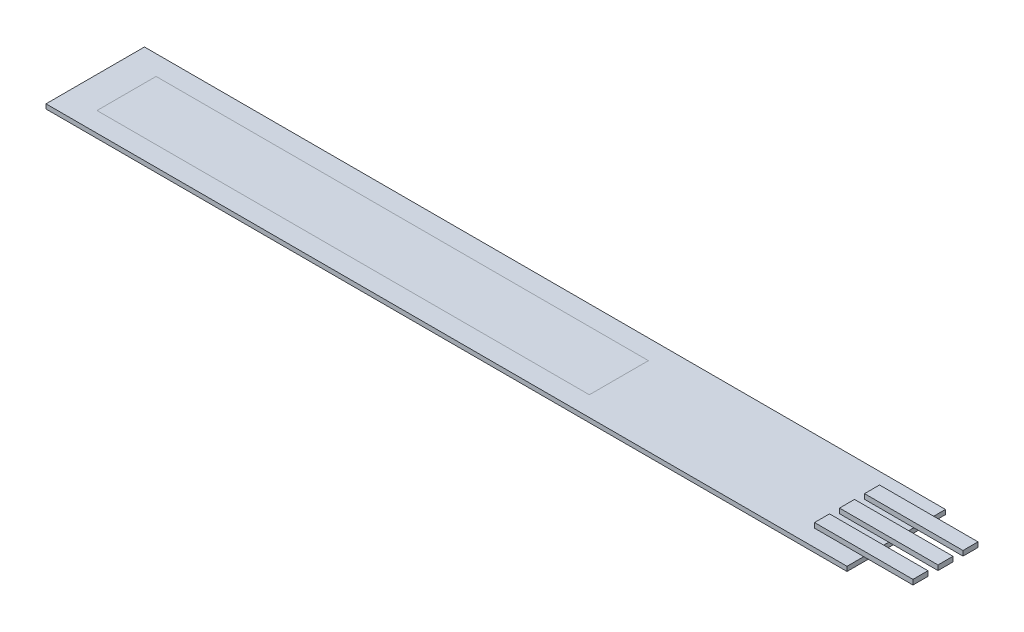
ISO-10303-21;
HEADER;
FILE_DESCRIPTION(('STEP AP214'),'2;1');
FILE_NAME('part.step','',(''),(''),'','','');
FILE_SCHEMA(('AUTOMOTIVE_DESIGN { 1 0 10303 214 1 1 1 1 }'));
ENDSEC;
DATA;
#1=APPLICATION_CONTEXT('core data for automotive mechanical design processes');
#2=APPLICATION_PROTOCOL_DEFINITION('international standard','automotive_design',2000,#1);
#3=PRODUCT_CONTEXT('',#1,'mechanical');
#4=PRODUCT('Part','Part','',(#3));
#5=PRODUCT_RELATED_PRODUCT_CATEGORY('part','',(#4));
#6=PRODUCT_DEFINITION_FORMATION('','',#4);
#7=PRODUCT_DEFINITION_CONTEXT('part definition',#1,'design');
#8=PRODUCT_DEFINITION('design','',#6,#7);
#9=PRODUCT_DEFINITION_SHAPE('','',#8);
#10=(LENGTH_UNIT() NAMED_UNIT(*) SI_UNIT(.MILLI.,.METRE.));
#11=(NAMED_UNIT(*) PLANE_ANGLE_UNIT() SI_UNIT($,.RADIAN.));
#12=(NAMED_UNIT(*) SI_UNIT($,.STERADIAN.) SOLID_ANGLE_UNIT());
#13=UNCERTAINTY_MEASURE_WITH_UNIT(LENGTH_MEASURE(1.E-05),#10,'distance_accuracy_value','');
#14=(GEOMETRIC_REPRESENTATION_CONTEXT(3) GLOBAL_UNCERTAINTY_ASSIGNED_CONTEXT((#13)) GLOBAL_UNIT_ASSIGNED_CONTEXT((#10,
#11,#12)) REPRESENTATION_CONTEXT('',''));
#15=CARTESIAN_POINT('',(0.,0.,0.));
#16=DIRECTION('',(0.,0.,1.));
#17=DIRECTION('',(1.,0.,0.));
#18=AXIS2_PLACEMENT_3D('',#15,#16,#17);
#19=CARTESIAN_POINT('',(53.18,-50.3587132480567,3.));
#20=DIRECTION('',(1.,0.,0.));
#21=DIRECTION('',(0.,0.,-1.));
#22=AXIS2_PLACEMENT_3D('',#19,#20,#21);
#23=PLANE('',#22);
#24=DIRECTION('',(0.,0.,1.));
#25=VECTOR('',#24,1.);
#26=CARTESIAN_POINT('',(53.18,0.,3.));
#27=LINE('',#26,#25);
#28=CARTESIAN_POINT('',(53.18,0.,-3.));
#29=VERTEX_POINT('',#28);
#30=CARTESIAN_POINT('',(53.18,0.,3.));
#31=VERTEX_POINT('',#30);
#32=EDGE_CURVE('E51',#29,#31,#27,.T.);
#33=ORIENTED_EDGE('',*,*,#32,.F.);
#34=DIRECTION('',(0.,1.,0.));
#35=VECTOR('',#34,1.);
#36=CARTESIAN_POINT('',(53.18,-50.3587132480567,-3.));
#37=LINE('',#36,#35);
#38=CARTESIAN_POINT('',(53.18,0.46,-3.));
#39=VERTEX_POINT('',#38);
#40=EDGE_CURVE('E77',#29,#39,#37,.T.);
#41=ORIENTED_EDGE('',*,*,#40,.T.);
#42=DIRECTION('',(0.,0.,-1.));
#43=VECTOR('',#42,1.);
#44=CARTESIAN_POINT('',(53.18,0.46,3.));
#45=LINE('',#44,#43);
#46=CARTESIAN_POINT('',(53.18,0.46,3.));
#47=VERTEX_POINT('',#46);
#48=EDGE_CURVE('E81',#47,#39,#45,.T.);
#49=ORIENTED_EDGE('',*,*,#48,.F.);
#50=DIRECTION('',(0.,1.,0.));
#51=VECTOR('',#50,1.);
#52=CARTESIAN_POINT('',(53.18,-50.3587132480567,3.));
#53=LINE('',#52,#51);
#54=EDGE_CURVE('E103',#31,#47,#53,.T.);
#55=ORIENTED_EDGE('',*,*,#54,.F.);
#56=EDGE_LOOP('',(#33,#41,#49,#55));
#57=FACE_BOUND('',#56,.T.);
#58=ADVANCED_FACE('F43',(#57),#23,.T.);
#59=CARTESIAN_POINT('',(3.18,-50.3587132480567,3.));
#60=DIRECTION('',(0.,0.,1.));
#61=DIRECTION('',(1.,0.,0.));
#62=AXIS2_PLACEMENT_3D('',#59,#60,#61);
#63=PLANE('',#62);
#64=DIRECTION('',(-1.,0.,0.));
#65=VECTOR('',#64,1.);
#66=CARTESIAN_POINT('',(3.18,0.,3.));
#67=LINE('',#66,#65);
#68=CARTESIAN_POINT('',(3.18,0.,3.));
#69=VERTEX_POINT('',#68);
#70=EDGE_CURVE('E115',#31,#69,#67,.T.);
#71=ORIENTED_EDGE('',*,*,#70,.F.);
#72=ORIENTED_EDGE('',*,*,#54,.T.);
#73=DIRECTION('',(1.,0.,0.));
#74=VECTOR('',#73,1.);
#75=CARTESIAN_POINT('',(3.18,0.46,3.));
#76=LINE('',#75,#74);
#77=CARTESIAN_POINT('',(3.18,0.46,3.));
#78=VERTEX_POINT('',#77);
#79=EDGE_CURVE('E85',#78,#47,#76,.T.);
#80=ORIENTED_EDGE('',*,*,#79,.F.);
#81=DIRECTION('',(0.,1.,0.));
#82=VECTOR('',#81,1.);
#83=CARTESIAN_POINT('',(3.18,-50.3587132480567,3.));
#84=LINE('',#83,#82);
#85=EDGE_CURVE('E106',#69,#78,#84,.T.);
#86=ORIENTED_EDGE('',*,*,#85,.F.);
#87=EDGE_LOOP('',(#71,#72,#80,#86));
#88=FACE_BOUND('',#87,.T.);
#89=ADVANCED_FACE('F114',(#88),#63,.T.);
#90=CARTESIAN_POINT('',(3.18,-50.3587132480567,-3.));
#91=DIRECTION('',(-1.,0.,0.));
#92=DIRECTION('',(0.,0.,1.));
#93=AXIS2_PLACEMENT_3D('',#90,#91,#92);
#94=PLANE('',#93);
#95=DIRECTION('',(0.,0.,-1.));
#96=VECTOR('',#95,1.);
#97=CARTESIAN_POINT('',(3.18,0.,-3.));
#98=LINE('',#97,#96);
#99=CARTESIAN_POINT('',(3.18,0.,-3.));
#100=VERTEX_POINT('',#99);
#101=EDGE_CURVE('E105',#69,#100,#98,.T.);
#102=ORIENTED_EDGE('',*,*,#101,.F.);
#103=ORIENTED_EDGE('',*,*,#85,.T.);
#104=DIRECTION('',(0.,0.,1.));
#105=VECTOR('',#104,1.);
#106=CARTESIAN_POINT('',(3.18,0.46,-3.));
#107=LINE('',#106,#105);
#108=CARTESIAN_POINT('',(3.18,0.46,-3.));
#109=VERTEX_POINT('',#108);
#110=EDGE_CURVE('E93',#109,#78,#107,.T.);
#111=ORIENTED_EDGE('',*,*,#110,.F.);
#112=DIRECTION('',(0.,1.,0.));
#113=VECTOR('',#112,1.);
#114=CARTESIAN_POINT('',(3.18,-50.3587132480567,-3.));
#115=LINE('',#114,#113);
#116=EDGE_CURVE('E84',#100,#109,#115,.T.);
#117=ORIENTED_EDGE('',*,*,#116,.F.);
#118=EDGE_LOOP('',(#102,#103,#111,#117));
#119=FACE_BOUND('',#118,.T.);
#120=ADVANCED_FACE('F111',(#119),#94,.T.);
#121=CARTESIAN_POINT('',(53.18,-50.3587132480567,-3.));
#122=DIRECTION('',(0.,0.,-1.));
#123=DIRECTION('',(-1.,0.,0.));
#124=AXIS2_PLACEMENT_3D('',#121,#122,#123);
#125=PLANE('',#124);
#126=DIRECTION('',(1.,0.,0.));
#127=VECTOR('',#126,1.);
#128=CARTESIAN_POINT('',(53.18,0.,-3.));
#129=LINE('',#128,#127);
#130=EDGE_CURVE('E12',#100,#29,#129,.T.);
#131=ORIENTED_EDGE('',*,*,#130,.F.);
#132=ORIENTED_EDGE('',*,*,#116,.T.);
#133=DIRECTION('',(-1.,0.,0.));
#134=VECTOR('',#133,1.);
#135=CARTESIAN_POINT('',(53.18,0.46,-3.));
#136=LINE('',#135,#134);
#137=EDGE_CURVE('E87',#39,#109,#136,.T.);
#138=ORIENTED_EDGE('',*,*,#137,.F.);
#139=ORIENTED_EDGE('',*,*,#40,.F.);
#140=EDGE_LOOP('',(#131,#132,#138,#139));
#141=FACE_BOUND('',#140,.T.);
#142=ADVANCED_FACE('F88',(#141),#125,.T.);
#143=CARTESIAN_POINT('',(0.,0.46,0.));
#144=DIRECTION('',(0.,1.,0.));
#145=DIRECTION('',(0.,0.,1.));
#146=AXIS2_PLACEMENT_3D('',#143,#144,#145);
#147=PLANE('',#146);
#148=ORIENTED_EDGE('',*,*,#48,.T.);
#149=ORIENTED_EDGE('',*,*,#137,.T.);
#150=ORIENTED_EDGE('',*,*,#110,.T.);
#151=ORIENTED_EDGE('',*,*,#79,.T.);
#152=EDGE_LOOP('',(#148,#149,#150,#151));
#153=FACE_BOUND('',#152,.T.);
#154=ADVANCED_FACE('F95',(#153),#147,.T.);
#155=CARTESIAN_POINT('',(0.,0.,0.));
#156=DIRECTION('',(0.,1.,0.));
#157=DIRECTION('',(0.,0.,1.));
#158=AXIS2_PLACEMENT_3D('',#155,#156,#157);
#159=PLANE('',#158);
#160=ORIENTED_EDGE('',*,*,#32,.T.);
#161=ORIENTED_EDGE('',*,*,#70,.T.);
#162=ORIENTED_EDGE('',*,*,#101,.T.);
#163=ORIENTED_EDGE('',*,*,#130,.T.);
#164=EDGE_LOOP('',(#160,#161,#162,#163));
#165=FACE_BOUND('',#164,.T.);
#166=ADVANCED_FACE('F116',(#165),#159,.F.);
#167=CLOSED_SHELL('',(#58,#89,#120,#142,#154,#166));
#168=MANIFOLD_SOLID_BREP('B2',#167);
#169=CARTESIAN_POINT('',(0.,0.46,0.));
#170=DIRECTION('',(0.,1.,0.));
#171=DIRECTION('',(0.,0.,1.));
#172=AXIS2_PLACEMENT_3D('',#169,#170,#171);
#173=PLANE('',#172);
#174=DIRECTION('',(1.,0.,0.));
#175=VECTOR('',#174,1.);
#176=CARTESIAN_POINT('',(3.18,0.46,3.));
#177=LINE('',#176,#175);
#178=CARTESIAN_POINT('',(3.18,0.46,3.));
#179=VERTEX_POINT('',#178);
#180=CARTESIAN_POINT('',(53.18,0.46,3.));
#181=VERTEX_POINT('',#180);
#182=EDGE_CURVE('E419',#179,#181,#177,.T.);
#183=ORIENTED_EDGE('',*,*,#182,.F.);
#184=DIRECTION('',(0.,0.,1.));
#185=VECTOR('',#184,1.);
#186=CARTESIAN_POINT('',(3.18,0.46,-3.));
#187=LINE('',#186,#185);
#188=CARTESIAN_POINT('',(3.18,0.46,-3.));
#189=VERTEX_POINT('',#188);
#190=EDGE_CURVE('E417',#189,#179,#187,.T.);
#191=ORIENTED_EDGE('',*,*,#190,.F.);
#192=DIRECTION('',(-1.,0.,0.));
#193=VECTOR('',#192,1.);
#194=CARTESIAN_POINT('',(3.18,0.46,-3.));
#195=LINE('',#194,#193);
#196=CARTESIAN_POINT('',(53.18,0.46,-3.));
#197=VERTEX_POINT('',#196);
#198=EDGE_CURVE('E425',#197,#189,#195,.T.);
#199=ORIENTED_EDGE('',*,*,#198,.F.);
#200=DIRECTION('',(0.,0.,-1.));
#201=VECTOR('',#200,1.);
#202=CARTESIAN_POINT('',(53.18,0.46,-3.));
#203=LINE('',#202,#201);
#204=EDGE_CURVE('E422',#181,#197,#203,.T.);
#205=ORIENTED_EDGE('',*,*,#204,.F.);
#206=EDGE_LOOP('',(#183,#191,#199,#205));
#207=FACE_BOUND('',#206,.T.);
#208=DIRECTION('',(0.,0.,-1.));
#209=VECTOR('',#208,1.);
#210=CARTESIAN_POINT('',(81.35,0.46,-5.));
#211=LINE('',#210,#209);
#212=CARTESIAN_POINT('',(81.35,0.46,5.));
#213=VERTEX_POINT('',#212);
#214=CARTESIAN_POINT('',(81.35,0.46,3.30108611503275));
#215=VERTEX_POINT('',#214);
#216=EDGE_CURVE('E455',#213,#215,#211,.T.);
#217=ORIENTED_EDGE('',*,*,#216,.T.);
#218=DIRECTION('',(1.,0.,0.));
#219=VECTOR('',#218,1.);
#220=CARTESIAN_POINT('',(76.35,0.46,3.30108611503275));
#221=LINE('',#220,#219);
#222=CARTESIAN_POINT('',(76.35,0.46,3.30108611503275));
#223=VERTEX_POINT('',#222);
#224=EDGE_CURVE('E184',#223,#215,#221,.T.);
#225=ORIENTED_EDGE('',*,*,#224,.F.);
#226=DIRECTION('',(0.,0.,1.));
#227=VECTOR('',#226,1.);
#228=CARTESIAN_POINT('',(76.35,0.46,1.77891388496725));
#229=LINE('',#228,#227);
#230=CARTESIAN_POINT('',(76.35,0.46,1.77891388496725));
#231=VERTEX_POINT('',#230);
#232=EDGE_CURVE('E189',#231,#223,#229,.T.);
#233=ORIENTED_EDGE('',*,*,#232,.F.);
#234=DIRECTION('',(-1.,0.,0.));
#235=VECTOR('',#234,1.);
#236=CARTESIAN_POINT('',(76.35,0.46,1.77891388496725));
#237=LINE('',#236,#235);
#238=CARTESIAN_POINT('',(81.35,0.46,1.77891388496725));
#239=VERTEX_POINT('',#238);
#240=EDGE_CURVE('E519',#239,#231,#237,.T.);
#241=ORIENTED_EDGE('',*,*,#240,.F.);
#242=CARTESIAN_POINT('',(81.35,0.46,0.761086115032753));
#243=VERTEX_POINT('',#242);
#244=EDGE_CURVE('E459',#239,#243,#211,.T.);
#245=ORIENTED_EDGE('',*,*,#244,.T.);
#246=DIRECTION('',(1.,0.,0.));
#247=VECTOR('',#246,1.);
#248=CARTESIAN_POINT('',(76.35,0.46,0.761086115032752));
#249=LINE('',#248,#247);
#250=CARTESIAN_POINT('',(76.35,0.46,0.761086115032752));
#251=VERTEX_POINT('',#250);
#252=EDGE_CURVE('E366',#251,#243,#249,.T.);
#253=ORIENTED_EDGE('',*,*,#252,.F.);
#254=DIRECTION('',(0.,0.,1.));
#255=VECTOR('',#254,1.);
#256=CARTESIAN_POINT('',(76.35,0.46,-0.761086115032749));
#257=LINE('',#256,#255);
#258=CARTESIAN_POINT('',(76.35,0.46,-0.761086115032749));
#259=VERTEX_POINT('',#258);
#260=EDGE_CURVE('E346',#259,#251,#257,.T.);
#261=ORIENTED_EDGE('',*,*,#260,.F.);
#262=DIRECTION('',(-1.,0.,0.));
#263=VECTOR('',#262,1.);
#264=CARTESIAN_POINT('',(76.35,0.46,-0.761086115032749));
#265=LINE('',#264,#263);
#266=CARTESIAN_POINT('',(81.35,0.46,-0.761086115032751));
#267=VERTEX_POINT('',#266);
#268=EDGE_CURVE('E371',#267,#259,#265,.T.);
#269=ORIENTED_EDGE('',*,*,#268,.F.);
#270=CARTESIAN_POINT('',(81.35,0.46,-1.77891388496725));
#271=VERTEX_POINT('',#270);
#272=EDGE_CURVE('E501',#267,#271,#211,.T.);
#273=ORIENTED_EDGE('',*,*,#272,.T.);
#274=DIRECTION('',(1.,0.,0.));
#275=VECTOR('',#274,1.);
#276=CARTESIAN_POINT('',(76.35,0.46,-1.77891388496725));
#277=LINE('',#276,#275);
#278=CARTESIAN_POINT('',(76.35,0.46,-1.77891388496725));
#279=VERTEX_POINT('',#278);
#280=EDGE_CURVE('E399',#279,#271,#277,.T.);
#281=ORIENTED_EDGE('',*,*,#280,.F.);
#282=DIRECTION('',(0.,0.,1.));
#283=VECTOR('',#282,1.);
#284=CARTESIAN_POINT('',(76.35,0.46,-3.30108611503275));
#285=LINE('',#284,#283);
#286=CARTESIAN_POINT('',(76.35,0.46,-3.30108611503275));
#287=VERTEX_POINT('',#286);
#288=EDGE_CURVE('E385',#287,#279,#285,.T.);
#289=ORIENTED_EDGE('',*,*,#288,.F.);
#290=DIRECTION('',(-1.,0.,0.));
#291=VECTOR('',#290,1.);
#292=CARTESIAN_POINT('',(76.35,0.46,-3.30108611503275));
#293=LINE('',#292,#291);
#294=CARTESIAN_POINT('',(81.35,0.46,-3.30108611503275));
#295=VERTEX_POINT('',#294);
#296=EDGE_CURVE('E41',#295,#287,#293,.T.);
#297=ORIENTED_EDGE('',*,*,#296,.F.);
#298=CARTESIAN_POINT('',(81.35,0.46,-5.));
#299=VERTEX_POINT('',#298);
#300=EDGE_CURVE('E454',#295,#299,#211,.T.);
#301=ORIENTED_EDGE('',*,*,#300,.T.);
#302=DIRECTION('',(-1.,0.,0.));
#303=VECTOR('',#302,1.);
#304=CARTESIAN_POINT('',(56.35,0.46,-5.));
#305=LINE('',#304,#303);
#306=CARTESIAN_POINT('',(0.,0.46,-5.));
#307=VERTEX_POINT('',#306);
#308=EDGE_CURVE('E457',#299,#307,#305,.T.);
#309=ORIENTED_EDGE('',*,*,#308,.T.);
#310=DIRECTION('',(0.,0.,1.));
#311=VECTOR('',#310,1.);
#312=CARTESIAN_POINT('',(0.,0.46,-5.));
#313=LINE('',#312,#311);
#314=CARTESIAN_POINT('',(0.,0.46,5.));
#315=VERTEX_POINT('',#314);
#316=EDGE_CURVE('E448',#307,#315,#313,.T.);
#317=ORIENTED_EDGE('',*,*,#316,.T.);
#318=DIRECTION('',(1.,0.,0.));
#319=VECTOR('',#318,1.);
#320=CARTESIAN_POINT('',(0.,0.46,5.));
#321=LINE('',#320,#319);
#322=EDGE_CURVE('E451',#315,#213,#321,.T.);
#323=ORIENTED_EDGE('',*,*,#322,.T.);
#324=EDGE_LOOP('',(#217,#225,#233,#241,#245,#253,#261,#269,#273,#281,#289,#297,#301,#309,#317,#323));
#325=FACE_BOUND('',#324,.T.);
#326=ADVANCED_FACE('F167',(#207,#325),#173,.T.);
#327=CARTESIAN_POINT('',(0.,0.,0.));
#328=DIRECTION('',(0.,1.,0.));
#329=DIRECTION('',(0.,0.,1.));
#330=AXIS2_PLACEMENT_3D('',#327,#328,#329);
#331=PLANE('',#330);
#332=DIRECTION('',(0.,0.,1.));
#333=VECTOR('',#332,1.);
#334=CARTESIAN_POINT('',(0.,0.,-5.));
#335=LINE('',#334,#333);
#336=CARTESIAN_POINT('',(0.,0.,-5.));
#337=VERTEX_POINT('',#336);
#338=CARTESIAN_POINT('',(0.,0.,5.));
#339=VERTEX_POINT('',#338);
#340=EDGE_CURVE('E447',#337,#339,#335,.T.);
#341=ORIENTED_EDGE('',*,*,#340,.F.);
#342=DIRECTION('',(-1.,0.,0.));
#343=VECTOR('',#342,1.);
#344=CARTESIAN_POINT('',(0.,0.,-5.));
#345=LINE('',#344,#343);
#346=CARTESIAN_POINT('',(81.35,0.,-5.));
#347=VERTEX_POINT('',#346);
#348=EDGE_CURVE('E452',#347,#337,#345,.T.);
#349=ORIENTED_EDGE('',*,*,#348,.F.);
#350=DIRECTION('',(0.,0.,-1.));
#351=VECTOR('',#350,1.);
#352=CARTESIAN_POINT('',(81.35,0.,-5.));
#353=LINE('',#352,#351);
#354=CARTESIAN_POINT('',(81.35,0.,5.));
#355=VERTEX_POINT('',#354);
#356=EDGE_CURVE('E467',#355,#347,#353,.T.);
#357=ORIENTED_EDGE('',*,*,#356,.F.);
#358=DIRECTION('',(1.,0.,0.));
#359=VECTOR('',#358,1.);
#360=CARTESIAN_POINT('',(56.35,0.,5.));
#361=LINE('',#360,#359);
#362=EDGE_CURVE('E465',#339,#355,#361,.T.);
#363=ORIENTED_EDGE('',*,*,#362,.F.);
#364=EDGE_LOOP('',(#341,#349,#357,#363));
#365=FACE_BOUND('',#364,.T.);
#366=DIRECTION('',(0.,0.,1.));
#367=VECTOR('',#366,1.);
#368=CARTESIAN_POINT('',(3.18,0.,-3.));
#369=LINE('',#368,#367);
#370=CARTESIAN_POINT('',(3.18,0.,-3.));
#371=VERTEX_POINT('',#370);
#372=CARTESIAN_POINT('',(3.18,0.,3.));
#373=VERTEX_POINT('',#372);
#374=EDGE_CURVE('E416',#371,#373,#369,.T.);
#375=ORIENTED_EDGE('',*,*,#374,.T.);
#376=DIRECTION('',(1.,0.,0.));
#377=VECTOR('',#376,1.);
#378=CARTESIAN_POINT('',(3.18,0.,3.));
#379=LINE('',#378,#377);
#380=CARTESIAN_POINT('',(53.18,0.,3.));
#381=VERTEX_POINT('',#380);
#382=EDGE_CURVE('E430',#373,#381,#379,.T.);
#383=ORIENTED_EDGE('',*,*,#382,.T.);
#384=DIRECTION('',(0.,0.,-1.));
#385=VECTOR('',#384,1.);
#386=CARTESIAN_POINT('',(53.18,0.,-3.));
#387=LINE('',#386,#385);
#388=CARTESIAN_POINT('',(53.18,0.,-3.));
#389=VERTEX_POINT('',#388);
#390=EDGE_CURVE('E433',#381,#389,#387,.T.);
#391=ORIENTED_EDGE('',*,*,#390,.T.);
#392=DIRECTION('',(-1.,0.,0.));
#393=VECTOR('',#392,1.);
#394=CARTESIAN_POINT('',(3.18,0.,-3.));
#395=LINE('',#394,#393);
#396=EDGE_CURVE('E420',#389,#371,#395,.T.);
#397=ORIENTED_EDGE('',*,*,#396,.T.);
#398=EDGE_LOOP('',(#375,#383,#391,#397));
#399=FACE_BOUND('',#398,.T.);
#400=ADVANCED_FACE('F490',(#365,#399),#331,.F.);
#401=CARTESIAN_POINT('',(0.,0.46,-5.));
#402=DIRECTION('',(1.,0.,0.));
#403=DIRECTION('',(0.,0.,-1.));
#404=AXIS2_PLACEMENT_3D('',#401,#402,#403);
#405=PLANE('',#404);
#406=ORIENTED_EDGE('',*,*,#340,.T.);
#407=DIRECTION('',(0.,-1.,0.));
#408=VECTOR('',#407,1.);
#409=CARTESIAN_POINT('',(0.,0.46,5.));
#410=LINE('',#409,#408);
#411=EDGE_CURVE('E171',#315,#339,#410,.T.);
#412=ORIENTED_EDGE('',*,*,#411,.F.);
#413=ORIENTED_EDGE('',*,*,#316,.F.);
#414=DIRECTION('',(0.,-1.,0.));
#415=VECTOR('',#414,1.);
#416=CARTESIAN_POINT('',(0.,0.46,-5.));
#417=LINE('',#416,#415);
#418=EDGE_CURVE('E462',#307,#337,#417,.T.);
#419=ORIENTED_EDGE('',*,*,#418,.T.);
#420=EDGE_LOOP('',(#406,#412,#413,#419));
#421=FACE_BOUND('',#420,.T.);
#422=ADVANCED_FACE('F169',(#421),#405,.F.);
#423=CARTESIAN_POINT('',(56.35,0.46,5.));
#424=DIRECTION('',(0.,0.,-1.));
#425=DIRECTION('',(-1.,0.,0.));
#426=AXIS2_PLACEMENT_3D('',#423,#424,#425);
#427=PLANE('',#426);
#428=ORIENTED_EDGE('',*,*,#362,.T.);
#429=DIRECTION('',(0.,-1.,0.));
#430=VECTOR('',#429,1.);
#431=CARTESIAN_POINT('',(81.35,0.46,5.));
#432=LINE('',#431,#430);
#433=EDGE_CURVE('E475',#213,#355,#432,.T.);
#434=ORIENTED_EDGE('',*,*,#433,.F.);
#435=ORIENTED_EDGE('',*,*,#322,.F.);
#436=ORIENTED_EDGE('',*,*,#411,.T.);
#437=EDGE_LOOP('',(#428,#434,#435,#436));
#438=FACE_BOUND('',#437,.T.);
#439=ADVANCED_FACE('F484',(#438),#427,.F.);
#440=CARTESIAN_POINT('',(81.35,0.46,-5.));
#441=DIRECTION('',(-1.,0.,0.));
#442=DIRECTION('',(0.,0.,1.));
#443=AXIS2_PLACEMENT_3D('',#440,#441,#442);
#444=PLANE('',#443);
#445=ORIENTED_EDGE('',*,*,#356,.T.);
#446=DIRECTION('',(0.,-1.,0.));
#447=VECTOR('',#446,1.);
#448=CARTESIAN_POINT('',(81.35,0.46,-5.));
#449=LINE('',#448,#447);
#450=EDGE_CURVE('E473',#299,#347,#449,.T.);
#451=ORIENTED_EDGE('',*,*,#450,.F.);
#452=ORIENTED_EDGE('',*,*,#300,.F.);
#453=EDGE_CURVE('E460',#271,#295,#211,.T.);
#454=ORIENTED_EDGE('',*,*,#453,.F.);
#455=ORIENTED_EDGE('',*,*,#272,.F.);
#456=EDGE_CURVE('E500',#243,#267,#211,.T.);
#457=ORIENTED_EDGE('',*,*,#456,.F.);
#458=ORIENTED_EDGE('',*,*,#244,.F.);
#459=EDGE_CURVE('E458',#215,#239,#211,.T.);
#460=ORIENTED_EDGE('',*,*,#459,.F.);
#461=ORIENTED_EDGE('',*,*,#216,.F.);
#462=ORIENTED_EDGE('',*,*,#433,.T.);
#463=EDGE_LOOP('',(#445,#451,#452,#454,#455,#457,#458,#460,#461,#462));
#464=FACE_BOUND('',#463,.T.);
#465=ADVANCED_FACE('F493',(#464),#444,.F.);
#466=CARTESIAN_POINT('',(0.,0.46,-5.));
#467=DIRECTION('',(0.,0.,1.));
#468=DIRECTION('',(1.,0.,0.));
#469=AXIS2_PLACEMENT_3D('',#466,#467,#468);
#470=PLANE('',#469);
#471=ORIENTED_EDGE('',*,*,#348,.T.);
#472=ORIENTED_EDGE('',*,*,#418,.F.);
#473=ORIENTED_EDGE('',*,*,#308,.F.);
#474=ORIENTED_EDGE('',*,*,#450,.T.);
#475=EDGE_LOOP('',(#471,#472,#473,#474));
#476=FACE_BOUND('',#475,.T.);
#477=ADVANCED_FACE('F497',(#476),#470,.F.);
#478=CARTESIAN_POINT('',(3.18,0.46,-3.));
#479=DIRECTION('',(1.,0.,0.));
#480=DIRECTION('',(0.,0.,-1.));
#481=AXIS2_PLACEMENT_3D('',#478,#479,#480);
#482=PLANE('',#481);
#483=ORIENTED_EDGE('',*,*,#374,.F.);
#484=DIRECTION('',(0.,-1.,0.));
#485=VECTOR('',#484,1.);
#486=CARTESIAN_POINT('',(3.18,0.46,-3.));
#487=LINE('',#486,#485);
#488=EDGE_CURVE('E427',#189,#371,#487,.T.);
#489=ORIENTED_EDGE('',*,*,#488,.F.);
#490=ORIENTED_EDGE('',*,*,#190,.T.);
#491=DIRECTION('',(0.,-1.,0.));
#492=VECTOR('',#491,1.);
#493=CARTESIAN_POINT('',(3.18,0.46,3.));
#494=LINE('',#493,#492);
#495=EDGE_CURVE('E444',#179,#373,#494,.T.);
#496=ORIENTED_EDGE('',*,*,#495,.T.);
#497=EDGE_LOOP('',(#483,#489,#490,#496));
#498=FACE_BOUND('',#497,.T.);
#499=ADVANCED_FACE('F549',(#498),#482,.T.);
#500=CARTESIAN_POINT('',(3.18,0.46,3.));
#501=DIRECTION('',(0.,0.,-1.));
#502=DIRECTION('',(-1.,0.,0.));
#503=AXIS2_PLACEMENT_3D('',#500,#501,#502);
#504=PLANE('',#503);
#505=ORIENTED_EDGE('',*,*,#382,.F.);
#506=ORIENTED_EDGE('',*,*,#495,.F.);
#507=ORIENTED_EDGE('',*,*,#182,.T.);
#508=DIRECTION('',(0.,-1.,0.));
#509=VECTOR('',#508,1.);
#510=CARTESIAN_POINT('',(53.18,0.46,3.));
#511=LINE('',#510,#509);
#512=EDGE_CURVE('E442',#181,#381,#511,.T.);
#513=ORIENTED_EDGE('',*,*,#512,.T.);
#514=EDGE_LOOP('',(#505,#506,#507,#513));
#515=FACE_BOUND('',#514,.T.);
#516=ADVANCED_FACE('F598',(#515),#504,.T.);
#517=CARTESIAN_POINT('',(53.18,0.46,-3.));
#518=DIRECTION('',(-1.,0.,0.));
#519=DIRECTION('',(0.,0.,1.));
#520=AXIS2_PLACEMENT_3D('',#517,#518,#519);
#521=PLANE('',#520);
#522=ORIENTED_EDGE('',*,*,#390,.F.);
#523=ORIENTED_EDGE('',*,*,#512,.F.);
#524=ORIENTED_EDGE('',*,*,#204,.T.);
#525=DIRECTION('',(0.,-1.,0.));
#526=VECTOR('',#525,1.);
#527=CARTESIAN_POINT('',(53.18,0.46,-3.));
#528=LINE('',#527,#526);
#529=EDGE_CURVE('E440',#197,#389,#528,.T.);
#530=ORIENTED_EDGE('',*,*,#529,.T.);
#531=EDGE_LOOP('',(#522,#523,#524,#530));
#532=FACE_BOUND('',#531,.T.);
#533=ADVANCED_FACE('F606',(#532),#521,.T.);
#534=CARTESIAN_POINT('',(3.18,0.46,-3.));
#535=DIRECTION('',(0.,0.,1.));
#536=DIRECTION('',(1.,0.,0.));
#537=AXIS2_PLACEMENT_3D('',#534,#535,#536);
#538=PLANE('',#537);
#539=ORIENTED_EDGE('',*,*,#396,.F.);
#540=ORIENTED_EDGE('',*,*,#529,.F.);
#541=ORIENTED_EDGE('',*,*,#198,.T.);
#542=ORIENTED_EDGE('',*,*,#488,.T.);
#543=EDGE_LOOP('',(#539,#540,#541,#542));
#544=FACE_BOUND('',#543,.T.);
#545=ADVANCED_FACE('F614',(#544),#538,.T.);
#546=CARTESIAN_POINT('',(0.,0.46,0.));
#547=DIRECTION('',(0.,1.,0.));
#548=DIRECTION('',(0.,0.,1.));
#549=AXIS2_PLACEMENT_3D('',#546,#547,#548);
#550=PLANE('',#549);
#551=CARTESIAN_POINT('',(86.35,0.46,-1.77891388496725));
#552=VERTEX_POINT('',#551);
#553=EDGE_CURVE('E398',#271,#552,#277,.T.);
#554=ORIENTED_EDGE('',*,*,#553,.F.);
#555=ORIENTED_EDGE('',*,*,#453,.T.);
#556=CARTESIAN_POINT('',(86.35,0.46,-3.30108611503275));
#557=VERTEX_POINT('',#556);
#558=EDGE_CURVE('E177',#557,#295,#293,.T.);
#559=ORIENTED_EDGE('',*,*,#558,.F.);
#560=DIRECTION('',(0.,0.,-1.));
#561=VECTOR('',#560,1.);
#562=CARTESIAN_POINT('',(86.35,0.46,-3.30108611503275));
#563=LINE('',#562,#561);
#564=EDGE_CURVE('E402',#552,#557,#563,.T.);
#565=ORIENTED_EDGE('',*,*,#564,.F.);
#566=EDGE_LOOP('',(#554,#555,#559,#565));
#567=FACE_BOUND('',#566,.T.);
#568=ADVANCED_FACE('F623',(#567),#550,.F.);
#569=CARTESIAN_POINT('',(76.35,0.96,-3.30108611503275));
#570=DIRECTION('',(1.,0.,0.));
#571=DIRECTION('',(0.,0.,-1.));
#572=AXIS2_PLACEMENT_3D('',#569,#570,#571);
#573=PLANE('',#572);
#574=ORIENTED_EDGE('',*,*,#288,.T.);
#575=DIRECTION('',(0.,-1.,0.));
#576=VECTOR('',#575,1.);
#577=CARTESIAN_POINT('',(76.35,0.96,-1.77891388496725));
#578=LINE('',#577,#576);
#579=CARTESIAN_POINT('',(76.35,0.96,-1.77891388496725));
#580=VERTEX_POINT('',#579);
#581=EDGE_CURVE('E413',#580,#279,#578,.T.);
#582=ORIENTED_EDGE('',*,*,#581,.F.);
#583=DIRECTION('',(0.,0.,1.));
#584=VECTOR('',#583,1.);
#585=CARTESIAN_POINT('',(76.35,0.96,-3.30108611503275));
#586=LINE('',#585,#584);
#587=CARTESIAN_POINT('',(76.35,0.96,-3.30108611503275));
#588=VERTEX_POINT('',#587);
#589=EDGE_CURVE('E386',#588,#580,#586,.T.);
#590=ORIENTED_EDGE('',*,*,#589,.F.);
#591=DIRECTION('',(0.,-1.,0.));
#592=VECTOR('',#591,1.);
#593=CARTESIAN_POINT('',(76.35,0.96,-3.30108611503275));
#594=LINE('',#593,#592);
#595=EDGE_CURVE('E395',#588,#287,#594,.T.);
#596=ORIENTED_EDGE('',*,*,#595,.T.);
#597=EDGE_LOOP('',(#574,#582,#590,#596));
#598=FACE_BOUND('',#597,.T.);
#599=ADVANCED_FACE('F635',(#598),#573,.F.);
#600=CARTESIAN_POINT('',(76.35,0.96,-1.77891388496725));
#601=DIRECTION('',(0.,0.,-1.));
#602=DIRECTION('',(-1.,0.,0.));
#603=AXIS2_PLACEMENT_3D('',#600,#601,#602);
#604=PLANE('',#603);
#605=ORIENTED_EDGE('',*,*,#280,.T.);
#606=ORIENTED_EDGE('',*,*,#553,.T.);
#607=DIRECTION('',(0.,-1.,0.));
#608=VECTOR('',#607,1.);
#609=CARTESIAN_POINT('',(86.35,0.96,-1.77891388496725));
#610=LINE('',#609,#608);
#611=CARTESIAN_POINT('',(86.35,0.96,-1.77891388496725));
#612=VERTEX_POINT('',#611);
#613=EDGE_CURVE('E410',#612,#552,#610,.T.);
#614=ORIENTED_EDGE('',*,*,#613,.F.);
#615=DIRECTION('',(1.,0.,0.));
#616=VECTOR('',#615,1.);
#617=CARTESIAN_POINT('',(76.35,0.96,-1.77891388496725));
#618=LINE('',#617,#616);
#619=EDGE_CURVE('E389',#580,#612,#618,.T.);
#620=ORIENTED_EDGE('',*,*,#619,.F.);
#621=ORIENTED_EDGE('',*,*,#581,.T.);
#622=EDGE_LOOP('',(#605,#606,#614,#620,#621));
#623=FACE_BOUND('',#622,.T.);
#624=ADVANCED_FACE('F644',(#623),#604,.F.);
#625=CARTESIAN_POINT('',(86.35,0.96,-3.30108611503275));
#626=DIRECTION('',(-1.,0.,0.));
#627=DIRECTION('',(0.,0.,1.));
#628=AXIS2_PLACEMENT_3D('',#625,#626,#627);
#629=PLANE('',#628);
#630=ORIENTED_EDGE('',*,*,#564,.T.);
#631=DIRECTION('',(0.,-1.,0.));
#632=VECTOR('',#631,1.);
#633=CARTESIAN_POINT('',(86.35,0.96,-3.30108611503275));
#634=LINE('',#633,#632);
#635=CARTESIAN_POINT('',(86.35,0.96,-3.30108611503275));
#636=VERTEX_POINT('',#635);
#637=EDGE_CURVE('E407',#636,#557,#634,.T.);
#638=ORIENTED_EDGE('',*,*,#637,.F.);
#639=DIRECTION('',(0.,0.,-1.));
#640=VECTOR('',#639,1.);
#641=CARTESIAN_POINT('',(86.35,0.96,-3.30108611503275));
#642=LINE('',#641,#640);
#643=EDGE_CURVE('E391',#612,#636,#642,.T.);
#644=ORIENTED_EDGE('',*,*,#643,.F.);
#645=ORIENTED_EDGE('',*,*,#613,.T.);
#646=EDGE_LOOP('',(#630,#638,#644,#645));
#647=FACE_BOUND('',#646,.T.);
#648=ADVANCED_FACE('F653',(#647),#629,.F.);
#649=CARTESIAN_POINT('',(76.35,0.96,-3.30108611503275));
#650=DIRECTION('',(0.,0.,1.));
#651=DIRECTION('',(1.,0.,0.));
#652=AXIS2_PLACEMENT_3D('',#649,#650,#651);
#653=PLANE('',#652);
#654=ORIENTED_EDGE('',*,*,#558,.T.);
#655=ORIENTED_EDGE('',*,*,#296,.T.);
#656=ORIENTED_EDGE('',*,*,#595,.F.);
#657=DIRECTION('',(-1.,0.,0.));
#658=VECTOR('',#657,1.);
#659=CARTESIAN_POINT('',(76.35,0.96,-3.30108611503275));
#660=LINE('',#659,#658);
#661=EDGE_CURVE('E393',#636,#588,#660,.T.);
#662=ORIENTED_EDGE('',*,*,#661,.F.);
#663=ORIENTED_EDGE('',*,*,#637,.T.);
#664=EDGE_LOOP('',(#654,#655,#656,#662,#663));
#665=FACE_BOUND('',#664,.T.);
#666=ADVANCED_FACE('F662',(#665),#653,.F.);
#667=CARTESIAN_POINT('',(0.,0.96,0.));
#668=DIRECTION('',(0.,1.,0.));
#669=DIRECTION('',(0.,0.,1.));
#670=AXIS2_PLACEMENT_3D('',#667,#668,#669);
#671=PLANE('',#670);
#672=ORIENTED_EDGE('',*,*,#589,.T.);
#673=ORIENTED_EDGE('',*,*,#619,.T.);
#674=ORIENTED_EDGE('',*,*,#643,.T.);
#675=ORIENTED_EDGE('',*,*,#661,.T.);
#676=EDGE_LOOP('',(#672,#673,#674,#675));
#677=FACE_BOUND('',#676,.T.);
#678=ADVANCED_FACE('F671',(#677),#671,.T.);
#679=CARTESIAN_POINT('',(0.,0.46,0.));
#680=DIRECTION('',(0.,1.,0.));
#681=DIRECTION('',(0.,0.,1.));
#682=AXIS2_PLACEMENT_3D('',#679,#680,#681);
#683=PLANE('',#682);
#684=CARTESIAN_POINT('',(86.35,0.46,0.761086115032752));
#685=VERTEX_POINT('',#684);
#686=EDGE_CURVE('E349',#243,#685,#249,.T.);
#687=ORIENTED_EDGE('',*,*,#686,.F.);
#688=ORIENTED_EDGE('',*,*,#456,.T.);
#689=CARTESIAN_POINT('',(86.35,0.46,-0.761086115032752));
#690=VERTEX_POINT('',#689);
#691=EDGE_CURVE('E359',#690,#267,#265,.T.);
#692=ORIENTED_EDGE('',*,*,#691,.F.);
#693=DIRECTION('',(0.,0.,-1.));
#694=VECTOR('',#693,1.);
#695=CARTESIAN_POINT('',(86.35,0.46,-0.761086115032752));
#696=LINE('',#695,#694);
#697=EDGE_CURVE('E369',#685,#690,#696,.T.);
#698=ORIENTED_EDGE('',*,*,#697,.F.);
#699=EDGE_LOOP('',(#687,#688,#692,#698));
#700=FACE_BOUND('',#699,.T.);
#701=ADVANCED_FACE('F680',(#700),#683,.F.);
#702=CARTESIAN_POINT('',(76.35,0.96,-0.761086115032749));
#703=DIRECTION('',(1.,0.,0.));
#704=DIRECTION('',(0.,0.,-1.));
#705=AXIS2_PLACEMENT_3D('',#702,#703,#704);
#706=PLANE('',#705);
#707=ORIENTED_EDGE('',*,*,#260,.T.);
#708=DIRECTION('',(0.,-1.,0.));
#709=VECTOR('',#708,1.);
#710=CARTESIAN_POINT('',(76.35,0.96,0.761086115032752));
#711=LINE('',#710,#709);
#712=CARTESIAN_POINT('',(76.35,0.96,0.761086115032752));
#713=VERTEX_POINT('',#712);
#714=EDGE_CURVE('E382',#713,#251,#711,.T.);
#715=ORIENTED_EDGE('',*,*,#714,.F.);
#716=DIRECTION('',(0.,0.,1.));
#717=VECTOR('',#716,1.);
#718=CARTESIAN_POINT('',(76.35,0.96,-0.761086115032749));
#719=LINE('',#718,#717);
#720=CARTESIAN_POINT('',(76.35,0.96,-0.761086115032749));
#721=VERTEX_POINT('',#720);
#722=EDGE_CURVE('E355',#721,#713,#719,.T.);
#723=ORIENTED_EDGE('',*,*,#722,.F.);
#724=DIRECTION('',(0.,-1.,0.));
#725=VECTOR('',#724,1.);
#726=CARTESIAN_POINT('',(76.35,0.96,-0.761086115032749));
#727=LINE('',#726,#725);
#728=EDGE_CURVE('E364',#721,#259,#727,.T.);
#729=ORIENTED_EDGE('',*,*,#728,.T.);
#730=EDGE_LOOP('',(#707,#715,#723,#729));
#731=FACE_BOUND('',#730,.T.);
#732=ADVANCED_FACE('F689',(#731),#706,.F.);
#733=CARTESIAN_POINT('',(76.35,0.96,0.761086115032752));
#734=DIRECTION('',(0.,0.,-1.));
#735=DIRECTION('',(-1.,0.,0.));
#736=AXIS2_PLACEMENT_3D('',#733,#734,#735);
#737=PLANE('',#736);
#738=ORIENTED_EDGE('',*,*,#252,.T.);
#739=ORIENTED_EDGE('',*,*,#686,.T.);
#740=DIRECTION('',(0.,-1.,0.));
#741=VECTOR('',#740,1.);
#742=CARTESIAN_POINT('',(86.35,0.96,0.761086115032752));
#743=LINE('',#742,#741);
#744=CARTESIAN_POINT('',(86.35,0.96,0.761086115032752));
#745=VERTEX_POINT('',#744);
#746=EDGE_CURVE('E379',#745,#685,#743,.T.);
#747=ORIENTED_EDGE('',*,*,#746,.F.);
#748=DIRECTION('',(1.,0.,0.));
#749=VECTOR('',#748,1.);
#750=CARTESIAN_POINT('',(76.35,0.96,0.761086115032752));
#751=LINE('',#750,#749);
#752=EDGE_CURVE('E358',#713,#745,#751,.T.);
#753=ORIENTED_EDGE('',*,*,#752,.F.);
#754=ORIENTED_EDGE('',*,*,#714,.T.);
#755=EDGE_LOOP('',(#738,#739,#747,#753,#754));
#756=FACE_BOUND('',#755,.T.);
#757=ADVANCED_FACE('F697',(#756),#737,.F.);
#758=CARTESIAN_POINT('',(86.35,0.96,-0.761086115032752));
#759=DIRECTION('',(-1.,0.,0.));
#760=DIRECTION('',(0.,0.,1.));
#761=AXIS2_PLACEMENT_3D('',#758,#759,#760);
#762=PLANE('',#761);
#763=ORIENTED_EDGE('',*,*,#697,.T.);
#764=DIRECTION('',(0.,-1.,0.));
#765=VECTOR('',#764,1.);
#766=CARTESIAN_POINT('',(86.35,0.96,-0.761086115032752));
#767=LINE('',#766,#765);
#768=CARTESIAN_POINT('',(86.35,0.96,-0.761086115032752));
#769=VERTEX_POINT('',#768);
#770=EDGE_CURVE('E376',#769,#690,#767,.T.);
#771=ORIENTED_EDGE('',*,*,#770,.F.);
#772=DIRECTION('',(0.,0.,-1.));
#773=VECTOR('',#772,1.);
#774=CARTESIAN_POINT('',(86.35,0.96,-0.761086115032752));
#775=LINE('',#774,#773);
#776=EDGE_CURVE('E361',#745,#769,#775,.T.);
#777=ORIENTED_EDGE('',*,*,#776,.F.);
#778=ORIENTED_EDGE('',*,*,#746,.T.);
#779=EDGE_LOOP('',(#763,#771,#777,#778));
#780=FACE_BOUND('',#779,.T.);
#781=ADVANCED_FACE('F706',(#780),#762,.F.);
#782=CARTESIAN_POINT('',(76.35,0.96,-0.761086115032749));
#783=DIRECTION('',(0.,0.,1.));
#784=DIRECTION('',(1.,0.,0.));
#785=AXIS2_PLACEMENT_3D('',#782,#783,#784);
#786=PLANE('',#785);
#787=ORIENTED_EDGE('',*,*,#691,.T.);
#788=ORIENTED_EDGE('',*,*,#268,.T.);
#789=ORIENTED_EDGE('',*,*,#728,.F.);
#790=DIRECTION('',(-1.,0.,0.));
#791=VECTOR('',#790,1.);
#792=CARTESIAN_POINT('',(76.35,0.96,-0.761086115032749));
#793=LINE('',#792,#791);
#794=EDGE_CURVE('E363',#769,#721,#793,.T.);
#795=ORIENTED_EDGE('',*,*,#794,.F.);
#796=ORIENTED_EDGE('',*,*,#770,.T.);
#797=EDGE_LOOP('',(#787,#788,#789,#795,#796));
#798=FACE_BOUND('',#797,.T.);
#799=ADVANCED_FACE('F715',(#798),#786,.F.);
#800=CARTESIAN_POINT('',(0.,0.96,0.));
#801=DIRECTION('',(0.,1.,0.));
#802=DIRECTION('',(0.,0.,1.));
#803=AXIS2_PLACEMENT_3D('',#800,#801,#802);
#804=PLANE('',#803);
#805=ORIENTED_EDGE('',*,*,#722,.T.);
#806=ORIENTED_EDGE('',*,*,#752,.T.);
#807=ORIENTED_EDGE('',*,*,#776,.T.);
#808=ORIENTED_EDGE('',*,*,#794,.T.);
#809=EDGE_LOOP('',(#805,#806,#807,#808));
#810=FACE_BOUND('',#809,.T.);
#811=ADVANCED_FACE('F724',(#810),#804,.T.);
#812=CARTESIAN_POINT('',(0.,0.46,0.));
#813=DIRECTION('',(0.,1.,0.));
#814=DIRECTION('',(0.,0.,1.));
#815=AXIS2_PLACEMENT_3D('',#812,#813,#814);
#816=PLANE('',#815);
#817=CARTESIAN_POINT('',(86.35,0.46,3.30108611503275));
#818=VERTEX_POINT('',#817);
#819=EDGE_CURVE('E515',#215,#818,#221,.T.);
#820=ORIENTED_EDGE('',*,*,#819,.F.);
#821=ORIENTED_EDGE('',*,*,#459,.T.);
#822=CARTESIAN_POINT('',(86.35,0.46,1.77891388496725));
#823=VERTEX_POINT('',#822);
#824=EDGE_CURVE('E343',#823,#239,#237,.T.);
#825=ORIENTED_EDGE('',*,*,#824,.F.);
#826=DIRECTION('',(0.,0.,-1.));
#827=VECTOR('',#826,1.);
#828=CARTESIAN_POINT('',(86.35,0.46,1.77891388496725));
#829=LINE('',#828,#827);
#830=EDGE_CURVE('E522',#818,#823,#829,.T.);
#831=ORIENTED_EDGE('',*,*,#830,.F.);
#832=EDGE_LOOP('',(#820,#821,#825,#831));
#833=FACE_BOUND('',#832,.T.);
#834=ADVANCED_FACE('F513',(#833),#816,.F.);
#835=CARTESIAN_POINT('',(76.35,0.96,1.77891388496725));
#836=DIRECTION('',(1.,0.,0.));
#837=DIRECTION('',(0.,0.,-1.));
#838=AXIS2_PLACEMENT_3D('',#835,#836,#837);
#839=PLANE('',#838);
#840=ORIENTED_EDGE('',*,*,#232,.T.);
#841=DIRECTION('',(0.,-1.,0.));
#842=VECTOR('',#841,1.);
#843=CARTESIAN_POINT('',(76.35,0.96,3.30108611503275));
#844=LINE('',#843,#842);
#845=CARTESIAN_POINT('',(76.35,0.96,3.30108611503275));
#846=VERTEX_POINT('',#845);
#847=EDGE_CURVE('E328',#846,#223,#844,.T.);
#848=ORIENTED_EDGE('',*,*,#847,.F.);
#849=DIRECTION('',(0.,0.,1.));
#850=VECTOR('',#849,1.);
#851=CARTESIAN_POINT('',(76.35,0.96,1.77891388496725));
#852=LINE('',#851,#850);
#853=CARTESIAN_POINT('',(76.35,0.96,1.77891388496725));
#854=VERTEX_POINT('',#853);
#855=EDGE_CURVE('E334',#854,#846,#852,.T.);
#856=ORIENTED_EDGE('',*,*,#855,.F.);
#857=DIRECTION('',(0.,-1.,0.));
#858=VECTOR('',#857,1.);
#859=CARTESIAN_POINT('',(76.35,0.96,1.77891388496725));
#860=LINE('',#859,#858);
#861=EDGE_CURVE('E526',#854,#231,#860,.T.);
#862=ORIENTED_EDGE('',*,*,#861,.T.);
#863=EDGE_LOOP('',(#840,#848,#856,#862));
#864=FACE_BOUND('',#863,.T.);
#865=ADVANCED_FACE('F345',(#864),#839,.F.);
#866=CARTESIAN_POINT('',(76.35,0.96,3.30108611503275));
#867=DIRECTION('',(0.,0.,-1.));
#868=DIRECTION('',(-1.,0.,0.));
#869=AXIS2_PLACEMENT_3D('',#866,#867,#868);
#870=PLANE('',#869);
#871=ORIENTED_EDGE('',*,*,#224,.T.);
#872=ORIENTED_EDGE('',*,*,#819,.T.);
#873=DIRECTION('',(0.,-1.,0.));
#874=VECTOR('',#873,1.);
#875=CARTESIAN_POINT('',(86.35,0.96,3.30108611503275));
#876=LINE('',#875,#874);
#877=CARTESIAN_POINT('',(86.35,0.96,3.30108611503275));
#878=VERTEX_POINT('',#877);
#879=EDGE_CURVE('E330',#878,#818,#876,.T.);
#880=ORIENTED_EDGE('',*,*,#879,.F.);
#881=DIRECTION('',(1.,0.,0.));
#882=VECTOR('',#881,1.);
#883=CARTESIAN_POINT('',(76.35,0.96,3.30108611503275));
#884=LINE('',#883,#882);
#885=EDGE_CURVE('E324',#846,#878,#884,.T.);
#886=ORIENTED_EDGE('',*,*,#885,.F.);
#887=ORIENTED_EDGE('',*,*,#847,.T.);
#888=EDGE_LOOP('',(#871,#872,#880,#886,#887));
#889=FACE_BOUND('',#888,.T.);
#890=ADVANCED_FACE('F326',(#889),#870,.F.);
#891=CARTESIAN_POINT('',(86.35,0.96,1.77891388496725));
#892=DIRECTION('',(-1.,0.,0.));
#893=DIRECTION('',(0.,0.,1.));
#894=AXIS2_PLACEMENT_3D('',#891,#892,#893);
#895=PLANE('',#894);
#896=ORIENTED_EDGE('',*,*,#830,.T.);
#897=DIRECTION('',(0.,-1.,0.));
#898=VECTOR('',#897,1.);
#899=CARTESIAN_POINT('',(86.35,0.96,1.77891388496725));
#900=LINE('',#899,#898);
#901=CARTESIAN_POINT('',(86.35,0.96,1.77891388496725));
#902=VERTEX_POINT('',#901);
#903=EDGE_CURVE('E351',#902,#823,#900,.T.);
#904=ORIENTED_EDGE('',*,*,#903,.F.);
#905=DIRECTION('',(0.,0.,-1.));
#906=VECTOR('',#905,1.);
#907=CARTESIAN_POINT('',(86.35,0.96,1.77891388496725));
#908=LINE('',#907,#906);
#909=EDGE_CURVE('E333',#878,#902,#908,.T.);
#910=ORIENTED_EDGE('',*,*,#909,.F.);
#911=ORIENTED_EDGE('',*,*,#879,.T.);
#912=EDGE_LOOP('',(#896,#904,#910,#911));
#913=FACE_BOUND('',#912,.T.);
#914=ADVANCED_FACE('F531',(#913),#895,.F.);
#915=CARTESIAN_POINT('',(76.35,0.96,1.77891388496725));
#916=DIRECTION('',(0.,0.,1.));
#917=DIRECTION('',(1.,0.,0.));
#918=AXIS2_PLACEMENT_3D('',#915,#916,#917);
#919=PLANE('',#918);
#920=ORIENTED_EDGE('',*,*,#824,.T.);
#921=ORIENTED_EDGE('',*,*,#240,.T.);
#922=ORIENTED_EDGE('',*,*,#861,.F.);
#923=DIRECTION('',(-1.,0.,0.));
#924=VECTOR('',#923,1.);
#925=CARTESIAN_POINT('',(76.35,0.96,1.77891388496725));
#926=LINE('',#925,#924);
#927=EDGE_CURVE('E339',#902,#854,#926,.T.);
#928=ORIENTED_EDGE('',*,*,#927,.F.);
#929=ORIENTED_EDGE('',*,*,#903,.T.);
#930=EDGE_LOOP('',(#920,#921,#922,#928,#929));
#931=FACE_BOUND('',#930,.T.);
#932=ADVANCED_FACE('F518',(#931),#919,.F.);
#933=CARTESIAN_POINT('',(0.,0.96,0.));
#934=DIRECTION('',(0.,1.,0.));
#935=DIRECTION('',(0.,0.,1.));
#936=AXIS2_PLACEMENT_3D('',#933,#934,#935);
#937=PLANE('',#936);
#938=ORIENTED_EDGE('',*,*,#855,.T.);
#939=ORIENTED_EDGE('',*,*,#885,.T.);
#940=ORIENTED_EDGE('',*,*,#909,.T.);
#941=ORIENTED_EDGE('',*,*,#927,.T.);
#942=EDGE_LOOP('',(#938,#939,#940,#941));
#943=FACE_BOUND('',#942,.T.);
#944=ADVANCED_FACE('F337',(#943),#937,.T.);
#945=CLOSED_SHELL('',(#326,#400,#422,#439,#465,#477,#499,#516,#533,#545,#568,#599,#624,#648,
#666,#678,#701,#732,#757,#781,#799,#811,#834,#865,#890,#914,#932,#944));
#946=MANIFOLD_SOLID_BREP('B6',#945);
#947=ADVANCED_BREP_SHAPE_REPRESENTATION('',(#18,#168,#946),#14);
#948=SHAPE_DEFINITION_REPRESENTATION(#9,#947);
ENDSEC;
END-ISO-10303-21;
